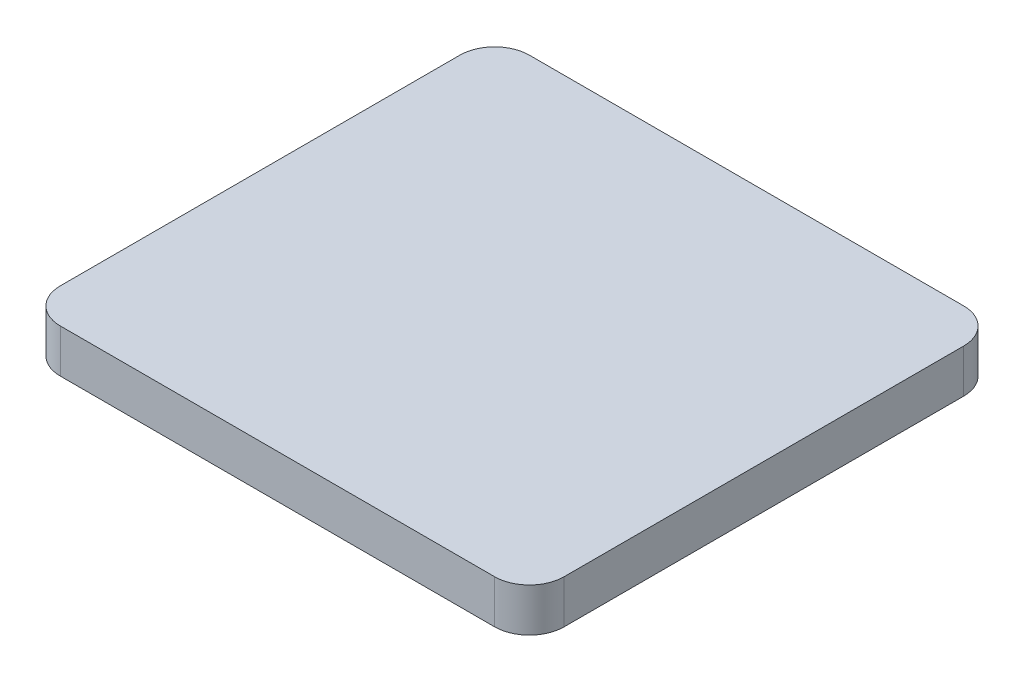
ISO-10303-21;
HEADER;
FILE_DESCRIPTION(('STEP AP214'),'2;1');
FILE_NAME('part.step','',(''),(''),'','','');
FILE_SCHEMA(('AUTOMOTIVE_DESIGN { 1 0 10303 214 1 1 1 1 }'));
ENDSEC;
DATA;
#1=APPLICATION_CONTEXT('core data for automotive mechanical design processes');
#2=APPLICATION_PROTOCOL_DEFINITION('international standard','automotive_design',2000,#1);
#3=PRODUCT_CONTEXT('',#1,'mechanical');
#4=PRODUCT('Part','Part','',(#3));
#5=PRODUCT_RELATED_PRODUCT_CATEGORY('part','',(#4));
#6=PRODUCT_DEFINITION_FORMATION('','',#4);
#7=PRODUCT_DEFINITION_CONTEXT('part definition',#1,'design');
#8=PRODUCT_DEFINITION('design','',#6,#7);
#9=PRODUCT_DEFINITION_SHAPE('','',#8);
#10=(LENGTH_UNIT() NAMED_UNIT(*) SI_UNIT(.MILLI.,.METRE.));
#11=(NAMED_UNIT(*) PLANE_ANGLE_UNIT() SI_UNIT($,.RADIAN.));
#12=(NAMED_UNIT(*) SI_UNIT($,.STERADIAN.) SOLID_ANGLE_UNIT());
#13=UNCERTAINTY_MEASURE_WITH_UNIT(LENGTH_MEASURE(1.E-05),#10,'distance_accuracy_value','');
#14=(GEOMETRIC_REPRESENTATION_CONTEXT(3) GLOBAL_UNCERTAINTY_ASSIGNED_CONTEXT((#13)) GLOBAL_UNIT_ASSIGNED_CONTEXT((#10,
#11,#12)) REPRESENTATION_CONTEXT('',''));
#15=CARTESIAN_POINT('',(0.,0.,0.));
#16=DIRECTION('',(0.,0.,1.));
#17=DIRECTION('',(1.,0.,0.));
#18=AXIS2_PLACEMENT_3D('',#15,#16,#17);
#19=CARTESIAN_POINT('',(-125.,25.,-20.));
#20=DIRECTION('',(0.,-1.,0.));
#21=DIRECTION('',(0.,0.,-1.));
#22=AXIS2_PLACEMENT_3D('',#19,#20,#21);
#23=CYLINDRICAL_SURFACE('',#22,20.);
#24=CARTESIAN_POINT('',(-125.,0.,-20.));
#25=DIRECTION('',(0.,1.,0.));
#26=DIRECTION('',(0.,0.,1.));
#27=AXIS2_PLACEMENT_3D('',#24,#25,#26);
#28=CIRCLE('',#27,20.);
#29=CARTESIAN_POINT('',(-145.,0.,-20.));
#30=VERTEX_POINT('',#29);
#31=CARTESIAN_POINT('',(-125.,0.,0.));
#32=VERTEX_POINT('',#31);
#33=EDGE_CURVE('E131',#30,#32,#28,.T.);
#34=ORIENTED_EDGE('',*,*,#33,.T.);
#35=DIRECTION('',(0.,-1.,0.));
#36=VECTOR('',#35,1.);
#37=CARTESIAN_POINT('',(-125.,25.,0.));
#38=LINE('',#37,#36);
#39=CARTESIAN_POINT('',(-125.,25.,0.));
#40=VERTEX_POINT('',#39);
#41=EDGE_CURVE('E11',#40,#32,#38,.T.);
#42=ORIENTED_EDGE('',*,*,#41,.F.);
#43=CARTESIAN_POINT('',(-125.,25.,-20.));
#44=DIRECTION('',(0.,1.,0.));
#45=DIRECTION('',(0.,0.,1.));
#46=AXIS2_PLACEMENT_3D('',#43,#44,#45);
#47=CIRCLE('',#46,20.);
#48=CARTESIAN_POINT('',(-145.,25.,-20.));
#49=VERTEX_POINT('',#48);
#50=EDGE_CURVE('E145',#49,#40,#47,.T.);
#51=ORIENTED_EDGE('',*,*,#50,.F.);
#52=DIRECTION('',(0.,-1.,0.));
#53=VECTOR('',#52,1.);
#54=CARTESIAN_POINT('',(-145.,25.,-20.));
#55=LINE('',#54,#53);
#56=EDGE_CURVE('E127',#49,#30,#55,.T.);
#57=ORIENTED_EDGE('',*,*,#56,.T.);
#58=EDGE_LOOP('',(#34,#42,#51,#57));
#59=FACE_BOUND('',#58,.T.);
#60=ADVANCED_FACE('F35',(#59),#23,.T.);
#61=CARTESIAN_POINT('',(-125.,25.,0.));
#62=DIRECTION('',(0.,0.,-1.));
#63=DIRECTION('',(-1.,0.,0.));
#64=AXIS2_PLACEMENT_3D('',#61,#62,#63);
#65=PLANE('',#64);
#66=DIRECTION('',(1.,0.,0.));
#67=VECTOR('',#66,1.);
#68=CARTESIAN_POINT('',(-125.,0.,0.));
#69=LINE('',#68,#67);
#70=CARTESIAN_POINT('',(125.,0.,0.));
#71=VERTEX_POINT('',#70);
#72=EDGE_CURVE('E134',#32,#71,#69,.T.);
#73=ORIENTED_EDGE('',*,*,#72,.T.);
#74=DIRECTION('',(0.,-1.,0.));
#75=VECTOR('',#74,1.);
#76=CARTESIAN_POINT('',(125.,25.,0.));
#77=LINE('',#76,#75);
#78=CARTESIAN_POINT('',(125.,25.,0.));
#79=VERTEX_POINT('',#78);
#80=EDGE_CURVE('E43',#79,#71,#77,.T.);
#81=ORIENTED_EDGE('',*,*,#80,.F.);
#82=DIRECTION('',(1.,0.,0.));
#83=VECTOR('',#82,1.);
#84=CARTESIAN_POINT('',(-125.,25.,0.));
#85=LINE('',#84,#83);
#86=EDGE_CURVE('E94',#40,#79,#85,.T.);
#87=ORIENTED_EDGE('',*,*,#86,.F.);
#88=ORIENTED_EDGE('',*,*,#41,.T.);
#89=EDGE_LOOP('',(#73,#81,#87,#88));
#90=FACE_BOUND('',#89,.T.);
#91=ADVANCED_FACE('F180',(#90),#65,.F.);
#92=CARTESIAN_POINT('',(125.,25.,-20.));
#93=DIRECTION('',(0.,-1.,0.));
#94=DIRECTION('',(0.,0.,-1.));
#95=AXIS2_PLACEMENT_3D('',#92,#93,#94);
#96=CYLINDRICAL_SURFACE('',#95,20.);
#97=CARTESIAN_POINT('',(125.,0.,-20.));
#98=DIRECTION('',(0.,1.,0.));
#99=DIRECTION('',(0.,0.,1.));
#100=AXIS2_PLACEMENT_3D('',#97,#98,#99);
#101=CIRCLE('',#100,20.);
#102=CARTESIAN_POINT('',(145.,0.,-20.));
#103=VERTEX_POINT('',#102);
#104=EDGE_CURVE('E136',#71,#103,#101,.T.);
#105=ORIENTED_EDGE('',*,*,#104,.T.);
#106=DIRECTION('',(0.,-1.,0.));
#107=VECTOR('',#106,1.);
#108=CARTESIAN_POINT('',(145.,25.,-20.));
#109=LINE('',#108,#107);
#110=CARTESIAN_POINT('',(145.,25.,-20.));
#111=VERTEX_POINT('',#110);
#112=EDGE_CURVE('E152',#111,#103,#109,.T.);
#113=ORIENTED_EDGE('',*,*,#112,.F.);
#114=CARTESIAN_POINT('',(125.,25.,-20.));
#115=DIRECTION('',(0.,1.,0.));
#116=DIRECTION('',(0.,0.,1.));
#117=AXIS2_PLACEMENT_3D('',#114,#115,#116);
#118=CIRCLE('',#117,20.);
#119=EDGE_CURVE('E160',#79,#111,#118,.T.);
#120=ORIENTED_EDGE('',*,*,#119,.F.);
#121=ORIENTED_EDGE('',*,*,#80,.T.);
#122=EDGE_LOOP('',(#105,#113,#120,#121));
#123=FACE_BOUND('',#122,.T.);
#124=ADVANCED_FACE('F158',(#123),#96,.T.);
#125=CARTESIAN_POINT('',(145.,25.,-250.));
#126=DIRECTION('',(-1.,0.,0.));
#127=DIRECTION('',(0.,0.,1.));
#128=AXIS2_PLACEMENT_3D('',#125,#126,#127);
#129=PLANE('',#128);
#130=DIRECTION('',(0.,0.,-1.));
#131=VECTOR('',#130,1.);
#132=CARTESIAN_POINT('',(145.,0.,-250.));
#133=LINE('',#132,#131);
#134=CARTESIAN_POINT('',(145.,0.,-250.));
#135=VERTEX_POINT('',#134);
#136=EDGE_CURVE('E138',#103,#135,#133,.T.);
#137=ORIENTED_EDGE('',*,*,#136,.T.);
#138=DIRECTION('',(0.,-1.,0.));
#139=VECTOR('',#138,1.);
#140=CARTESIAN_POINT('',(145.,25.,-250.));
#141=LINE('',#140,#139);
#142=CARTESIAN_POINT('',(145.,25.,-250.));
#143=VERTEX_POINT('',#142);
#144=EDGE_CURVE('E149',#143,#135,#141,.T.);
#145=ORIENTED_EDGE('',*,*,#144,.F.);
#146=DIRECTION('',(0.,0.,-1.));
#147=VECTOR('',#146,1.);
#148=CARTESIAN_POINT('',(145.,25.,-250.));
#149=LINE('',#148,#147);
#150=EDGE_CURVE('E172',#111,#143,#149,.T.);
#151=ORIENTED_EDGE('',*,*,#150,.F.);
#152=ORIENTED_EDGE('',*,*,#112,.T.);
#153=EDGE_LOOP('',(#137,#145,#151,#152));
#154=FACE_BOUND('',#153,.T.);
#155=ADVANCED_FACE('F168',(#154),#129,.F.);
#156=CARTESIAN_POINT('',(125.,25.,-250.));
#157=DIRECTION('',(0.,-1.,0.));
#158=DIRECTION('',(0.,0.,-1.));
#159=AXIS2_PLACEMENT_3D('',#156,#157,#158);
#160=CYLINDRICAL_SURFACE('',#159,20.);
#161=CARTESIAN_POINT('',(125.,0.,-250.));
#162=DIRECTION('',(0.,1.,0.));
#163=DIRECTION('',(0.,0.,-1.));
#164=AXIS2_PLACEMENT_3D('',#161,#162,#163);
#165=CIRCLE('',#164,20.);
#166=CARTESIAN_POINT('',(125.,0.,-270.));
#167=VERTEX_POINT('',#166);
#168=EDGE_CURVE('E140',#135,#167,#165,.T.);
#169=ORIENTED_EDGE('',*,*,#168,.T.);
#170=DIRECTION('',(0.,-1.,0.));
#171=VECTOR('',#170,1.);
#172=CARTESIAN_POINT('',(125.,25.,-270.));
#173=LINE('',#172,#171);
#174=CARTESIAN_POINT('',(125.,25.,-270.));
#175=VERTEX_POINT('',#174);
#176=EDGE_CURVE('E122',#175,#167,#173,.T.);
#177=ORIENTED_EDGE('',*,*,#176,.F.);
#178=CARTESIAN_POINT('',(125.,25.,-250.));
#179=DIRECTION('',(0.,1.,0.));
#180=DIRECTION('',(0.,0.,-1.));
#181=AXIS2_PLACEMENT_3D('',#178,#179,#180);
#182=CIRCLE('',#181,20.);
#183=EDGE_CURVE('E113',#143,#175,#182,.T.);
#184=ORIENTED_EDGE('',*,*,#183,.F.);
#185=ORIENTED_EDGE('',*,*,#144,.T.);
#186=EDGE_LOOP('',(#169,#177,#184,#185));
#187=FACE_BOUND('',#186,.T.);
#188=ADVANCED_FACE('F171',(#187),#160,.T.);
#189=CARTESIAN_POINT('',(-125.,25.,-270.));
#190=DIRECTION('',(0.,0.,1.));
#191=DIRECTION('',(1.,0.,0.));
#192=AXIS2_PLACEMENT_3D('',#189,#190,#191);
#193=PLANE('',#192);
#194=DIRECTION('',(-1.,0.,0.));
#195=VECTOR('',#194,1.);
#196=CARTESIAN_POINT('',(-125.,0.,-270.));
#197=LINE('',#196,#195);
#198=CARTESIAN_POINT('',(-125.,0.,-270.));
#199=VERTEX_POINT('',#198);
#200=EDGE_CURVE('E121',#167,#199,#197,.T.);
#201=ORIENTED_EDGE('',*,*,#200,.T.);
#202=DIRECTION('',(0.,-1.,0.));
#203=VECTOR('',#202,1.);
#204=CARTESIAN_POINT('',(-125.,25.,-270.));
#205=LINE('',#204,#203);
#206=CARTESIAN_POINT('',(-125.,25.,-270.));
#207=VERTEX_POINT('',#206);
#208=EDGE_CURVE('E118',#207,#199,#205,.T.);
#209=ORIENTED_EDGE('',*,*,#208,.F.);
#210=DIRECTION('',(-1.,0.,0.));
#211=VECTOR('',#210,1.);
#212=CARTESIAN_POINT('',(-125.,25.,-270.));
#213=LINE('',#212,#211);
#214=EDGE_CURVE('E107',#175,#207,#213,.T.);
#215=ORIENTED_EDGE('',*,*,#214,.F.);
#216=ORIENTED_EDGE('',*,*,#176,.T.);
#217=EDGE_LOOP('',(#201,#209,#215,#216));
#218=FACE_BOUND('',#217,.T.);
#219=ADVANCED_FACE('F119',(#218),#193,.F.);
#220=CARTESIAN_POINT('',(-125.,25.,-250.));
#221=DIRECTION('',(0.,-1.,0.));
#222=DIRECTION('',(0.,0.,-1.));
#223=AXIS2_PLACEMENT_3D('',#220,#221,#222);
#224=CYLINDRICAL_SURFACE('',#223,20.);
#225=CARTESIAN_POINT('',(-125.,0.,-250.));
#226=DIRECTION('',(0.,1.,0.));
#227=DIRECTION('',(0.,0.,1.));
#228=AXIS2_PLACEMENT_3D('',#225,#226,#227);
#229=CIRCLE('',#228,20.);
#230=CARTESIAN_POINT('',(-145.,0.,-250.));
#231=VERTEX_POINT('',#230);
#232=EDGE_CURVE('E80',#199,#231,#229,.T.);
#233=ORIENTED_EDGE('',*,*,#232,.T.);
#234=DIRECTION('',(0.,-1.,0.));
#235=VECTOR('',#234,1.);
#236=CARTESIAN_POINT('',(-145.,25.,-250.));
#237=LINE('',#236,#235);
#238=CARTESIAN_POINT('',(-145.,25.,-250.));
#239=VERTEX_POINT('',#238);
#240=EDGE_CURVE('E123',#239,#231,#237,.T.);
#241=ORIENTED_EDGE('',*,*,#240,.F.);
#242=CARTESIAN_POINT('',(-125.,25.,-250.));
#243=DIRECTION('',(0.,1.,0.));
#244=DIRECTION('',(0.,0.,1.));
#245=AXIS2_PLACEMENT_3D('',#242,#243,#244);
#246=CIRCLE('',#245,20.);
#247=EDGE_CURVE('E111',#207,#239,#246,.T.);
#248=ORIENTED_EDGE('',*,*,#247,.F.);
#249=ORIENTED_EDGE('',*,*,#208,.T.);
#250=EDGE_LOOP('',(#233,#241,#248,#249));
#251=FACE_BOUND('',#250,.T.);
#252=ADVANCED_FACE('F125',(#251),#224,.T.);
#253=CARTESIAN_POINT('',(-145.,25.,-250.));
#254=DIRECTION('',(1.,0.,0.));
#255=DIRECTION('',(0.,0.,-1.));
#256=AXIS2_PLACEMENT_3D('',#253,#254,#255);
#257=PLANE('',#256);
#258=DIRECTION('',(0.,0.,1.));
#259=VECTOR('',#258,1.);
#260=CARTESIAN_POINT('',(-145.,0.,-250.));
#261=LINE('',#260,#259);
#262=EDGE_CURVE('E86',#231,#30,#261,.T.);
#263=ORIENTED_EDGE('',*,*,#262,.T.);
#264=ORIENTED_EDGE('',*,*,#56,.F.);
#265=DIRECTION('',(0.,0.,1.));
#266=VECTOR('',#265,1.);
#267=CARTESIAN_POINT('',(-145.,25.,-250.));
#268=LINE('',#267,#266);
#269=EDGE_CURVE('E51',#239,#49,#268,.T.);
#270=ORIENTED_EDGE('',*,*,#269,.F.);
#271=ORIENTED_EDGE('',*,*,#240,.T.);
#272=EDGE_LOOP('',(#263,#264,#270,#271));
#273=FACE_BOUND('',#272,.T.);
#274=ADVANCED_FACE('F196',(#273),#257,.F.);
#275=CARTESIAN_POINT('',(-125.,25.,-20.));
#276=DIRECTION('',(0.,1.,0.));
#277=DIRECTION('',(0.,0.,1.));
#278=AXIS2_PLACEMENT_3D('',#275,#276,#277);
#279=PLANE('',#278);
#280=ORIENTED_EDGE('',*,*,#50,.T.);
#281=ORIENTED_EDGE('',*,*,#86,.T.);
#282=ORIENTED_EDGE('',*,*,#119,.T.);
#283=ORIENTED_EDGE('',*,*,#150,.T.);
#284=ORIENTED_EDGE('',*,*,#183,.T.);
#285=ORIENTED_EDGE('',*,*,#214,.T.);
#286=ORIENTED_EDGE('',*,*,#247,.T.);
#287=ORIENTED_EDGE('',*,*,#269,.T.);
#288=EDGE_LOOP('',(#280,#281,#282,#283,#284,#285,#286,#287));
#289=FACE_BOUND('',#288,.T.);
#290=ADVANCED_FACE('F109',(#289),#279,.T.);
#291=CARTESIAN_POINT('',(-125.,0.,-20.));
#292=DIRECTION('',(0.,1.,0.));
#293=DIRECTION('',(0.,0.,1.));
#294=AXIS2_PLACEMENT_3D('',#291,#292,#293);
#295=PLANE('',#294);
#296=ORIENTED_EDGE('',*,*,#33,.F.);
#297=ORIENTED_EDGE('',*,*,#262,.F.);
#298=ORIENTED_EDGE('',*,*,#232,.F.);
#299=ORIENTED_EDGE('',*,*,#200,.F.);
#300=ORIENTED_EDGE('',*,*,#168,.F.);
#301=ORIENTED_EDGE('',*,*,#136,.F.);
#302=ORIENTED_EDGE('',*,*,#104,.F.);
#303=ORIENTED_EDGE('',*,*,#72,.F.);
#304=EDGE_LOOP('',(#296,#297,#298,#299,#300,#301,#302,#303));
#305=FACE_BOUND('',#304,.T.);
#306=ADVANCED_FACE('F164',(#305),#295,.F.);
#307=CLOSED_SHELL('',(#60,#91,#124,#155,#188,#219,#252,#274,#290,#306));
#308=MANIFOLD_SOLID_BREP('B2',#307);
#309=ADVANCED_BREP_SHAPE_REPRESENTATION('',(#18,#308),#14);
#310=SHAPE_DEFINITION_REPRESENTATION(#9,#309);
ENDSEC;
END-ISO-10303-21;
